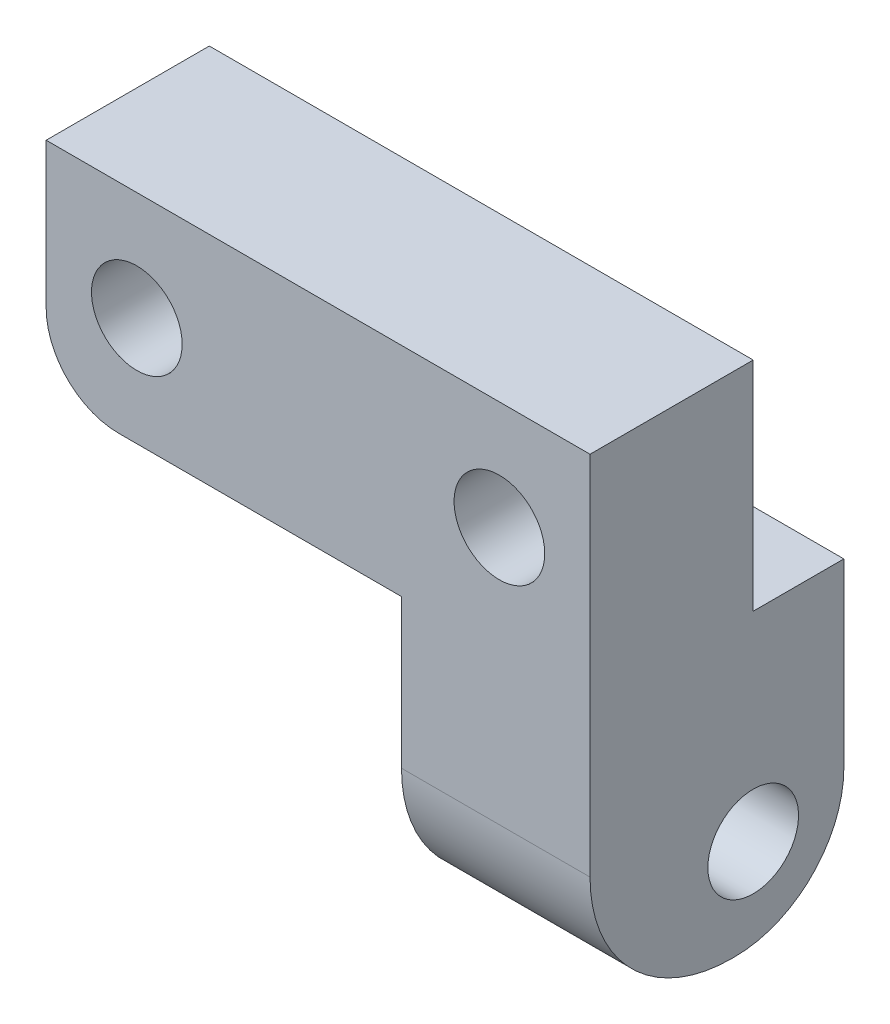
ISO-10303-21;
HEADER;
FILE_DESCRIPTION(('STEP AP214'),'2;1');
FILE_NAME('part.step','',(''),(''),'','','');
FILE_SCHEMA(('AUTOMOTIVE_DESIGN { 1 0 10303 214 1 1 1 1 }'));
ENDSEC;
DATA;
#1=APPLICATION_CONTEXT('core data for automotive mechanical design processes');
#2=APPLICATION_PROTOCOL_DEFINITION('international standard','automotive_design',2000,#1);
#3=PRODUCT_CONTEXT('',#1,'mechanical');
#4=PRODUCT('Part','Part','',(#3));
#5=PRODUCT_RELATED_PRODUCT_CATEGORY('part','',(#4));
#6=PRODUCT_DEFINITION_FORMATION('','',#4);
#7=PRODUCT_DEFINITION_CONTEXT('part definition',#1,'design');
#8=PRODUCT_DEFINITION('design','',#6,#7);
#9=PRODUCT_DEFINITION_SHAPE('','',#8);
#10=(LENGTH_UNIT() NAMED_UNIT(*) SI_UNIT(.MILLI.,.METRE.));
#11=(NAMED_UNIT(*) PLANE_ANGLE_UNIT() SI_UNIT($,.RADIAN.));
#12=(NAMED_UNIT(*) SI_UNIT($,.STERADIAN.) SOLID_ANGLE_UNIT());
#13=UNCERTAINTY_MEASURE_WITH_UNIT(LENGTH_MEASURE(1.E-05),#10,'distance_accuracy_value','');
#14=(GEOMETRIC_REPRESENTATION_CONTEXT(3) GLOBAL_UNCERTAINTY_ASSIGNED_CONTEXT((#13)) GLOBAL_UNIT_ASSIGNED_CONTEXT((#10,
#11,#12)) REPRESENTATION_CONTEXT('',''));
#15=CARTESIAN_POINT('',(0.,0.,0.));
#16=DIRECTION('',(0.,0.,1.));
#17=DIRECTION('',(1.,0.,0.));
#18=AXIS2_PLACEMENT_3D('',#15,#16,#17);
#19=CARTESIAN_POINT('',(0.,0.,0.));
#20=DIRECTION('',(0.,0.,-1.));
#21=DIRECTION('',(-1.,0.,0.));
#22=AXIS2_PLACEMENT_3D('',#19,#20,#21);
#23=PLANE('',#22);
#24=CARTESIAN_POINT('',(-5.,0.,0.));
#25=DIRECTION('',(0.,0.,1.));
#26=DIRECTION('',(1.,0.,0.));
#27=AXIS2_PLACEMENT_3D('',#24,#25,#26);
#28=CIRCLE('',#27,1.25);
#29=CARTESIAN_POINT('',(-3.75,0.,0.));
#30=VERTEX_POINT('',#29);
#31=EDGE_CURVE('E219',#30,#30,#28,.T.);
#32=ORIENTED_EDGE('',*,*,#31,.T.);
#33=EDGE_LOOP('',(#32));
#34=FACE_BOUND('',#33,.T.);
#35=DIRECTION('',(1.,0.,0.));
#36=VECTOR('',#35,1.);
#37=CARTESIAN_POINT('',(-7.5,-3.,0.));
#38=LINE('',#37,#36);
#39=CARTESIAN_POINT('',(-5.5,-3.,0.));
#40=VERTEX_POINT('',#39);
#41=CARTESIAN_POINT('',(2.3,-3.,0.));
#42=VERTEX_POINT('',#41);
#43=EDGE_CURVE('E193',#40,#42,#38,.T.);
#44=ORIENTED_EDGE('',*,*,#43,.F.);
#45=CARTESIAN_POINT('',(-5.5,-1.,0.));
#46=DIRECTION('',(0.,0.,-1.));
#47=DIRECTION('',(-1.,0.,0.));
#48=AXIS2_PLACEMENT_3D('',#45,#46,#47);
#49=CIRCLE('',#48,2.);
#50=CARTESIAN_POINT('',(-7.5,-1.,0.));
#51=VERTEX_POINT('',#50);
#52=EDGE_CURVE('E62',#40,#51,#49,.T.);
#53=ORIENTED_EDGE('',*,*,#52,.T.);
#54=DIRECTION('',(0.,-1.,0.));
#55=VECTOR('',#54,1.);
#56=CARTESIAN_POINT('',(-7.5,-3.,0.));
#57=LINE('',#56,#55);
#58=CARTESIAN_POINT('',(-7.5,3.,0.));
#59=VERTEX_POINT('',#58);
#60=EDGE_CURVE('E202',#59,#51,#57,.T.);
#61=ORIENTED_EDGE('',*,*,#60,.F.);
#62=DIRECTION('',(-1.,0.,0.));
#63=VECTOR('',#62,1.);
#64=CARTESIAN_POINT('',(-7.5,3.,0.));
#65=LINE('',#64,#63);
#66=CARTESIAN_POINT('',(7.5,3.,0.));
#67=VERTEX_POINT('',#66);
#68=EDGE_CURVE('E205',#67,#59,#65,.T.);
#69=ORIENTED_EDGE('',*,*,#68,.F.);
#70=DIRECTION('',(0.,1.,0.));
#71=VECTOR('',#70,1.);
#72=CARTESIAN_POINT('',(7.5,-3.,0.));
#73=LINE('',#72,#71);
#74=CARTESIAN_POINT('',(7.5,-3.,0.));
#75=VERTEX_POINT('',#74);
#76=EDGE_CURVE('E207',#75,#67,#73,.T.);
#77=ORIENTED_EDGE('',*,*,#76,.F.);
#78=EDGE_CURVE('E198',#42,#75,#38,.T.);
#79=ORIENTED_EDGE('',*,*,#78,.F.);
#80=EDGE_LOOP('',(#44,#53,#61,#69,#77,#79));
#81=FACE_BOUND('',#80,.T.);
#82=CARTESIAN_POINT('',(5.,0.,0.));
#83=DIRECTION('',(0.,0.,1.));
#84=DIRECTION('',(1.,0.,0.));
#85=AXIS2_PLACEMENT_3D('',#82,#83,#84);
#86=CIRCLE('',#85,1.25);
#87=CARTESIAN_POINT('',(6.25,0.,0.));
#88=VERTEX_POINT('',#87);
#89=EDGE_CURVE('E209',#88,#88,#86,.T.);
#90=ORIENTED_EDGE('',*,*,#89,.T.);
#91=EDGE_LOOP('',(#90));
#92=FACE_BOUND('',#91,.T.);
#93=ADVANCED_FACE('F40',(#34,#81,#92),#23,.T.);
#94=CARTESIAN_POINT('',(7.5,-3.,4.5));
#95=DIRECTION('',(-1.,0.,0.));
#96=DIRECTION('',(0.,0.,1.));
#97=AXIS2_PLACEMENT_3D('',#94,#95,#96);
#98=PLANE('',#97);
#99=CARTESIAN_POINT('',(7.5,-8.5,0.));
#100=DIRECTION('',(-1.,0.,0.));
#101=DIRECTION('',(0.,0.,1.));
#102=AXIS2_PLACEMENT_3D('',#99,#100,#101);
#103=CIRCLE('',#102,1.25);
#104=CARTESIAN_POINT('',(7.5,-8.5,1.25));
#105=VERTEX_POINT('',#104);
#106=EDGE_CURVE('E148',#105,#105,#103,.T.);
#107=ORIENTED_EDGE('',*,*,#106,.T.);
#108=EDGE_LOOP('',(#107));
#109=FACE_BOUND('',#108,.T.);
#110=DIRECTION('',(0.,0.,1.));
#111=VECTOR('',#110,1.);
#112=CARTESIAN_POINT('',(7.5,-11.,4.5));
#113=LINE('',#112,#111);
#114=CARTESIAN_POINT('',(7.5,-11.,0.499999999999999));
#115=VERTEX_POINT('',#114);
#116=CARTESIAN_POINT('',(7.5,-11.,0.6));
#117=VERTEX_POINT('',#116);
#118=EDGE_CURVE('E225',#115,#117,#113,.T.);
#119=ORIENTED_EDGE('',*,*,#118,.F.);
#120=CARTESIAN_POINT('',(7.5,-8.,0.499999999999999));
#121=DIRECTION('',(-1.,0.,0.));
#122=DIRECTION('',(0.,0.,1.));
#123=AXIS2_PLACEMENT_3D('',#120,#121,#122);
#124=CIRCLE('',#123,3.);
#125=CARTESIAN_POINT('',(7.5,-8.,-2.5));
#126=VERTEX_POINT('',#125);
#127=EDGE_CURVE('E186',#115,#126,#124,.F.);
#128=ORIENTED_EDGE('',*,*,#127,.T.);
#129=DIRECTION('',(0.,-1.,0.));
#130=VECTOR('',#129,1.);
#131=CARTESIAN_POINT('',(7.5,-11.,-2.5));
#132=LINE('',#131,#130);
#133=CARTESIAN_POINT('',(7.5,-3.,-2.5));
#134=VERTEX_POINT('',#133);
#135=EDGE_CURVE('E140',#134,#126,#132,.T.);
#136=ORIENTED_EDGE('',*,*,#135,.F.);
#137=DIRECTION('',(0.,0.,-1.));
#138=VECTOR('',#137,1.);
#139=CARTESIAN_POINT('',(7.5,-3.,4.5));
#140=LINE('',#139,#138);
#141=EDGE_CURVE('E138',#75,#134,#140,.T.);
#142=ORIENTED_EDGE('',*,*,#141,.F.);
#143=ORIENTED_EDGE('',*,*,#76,.T.);
#144=DIRECTION('',(0.,0.,-1.));
#145=VECTOR('',#144,1.);
#146=CARTESIAN_POINT('',(7.5,3.,4.5));
#147=LINE('',#146,#145);
#148=CARTESIAN_POINT('',(7.5,3.,4.5));
#149=VERTEX_POINT('',#148);
#150=EDGE_CURVE('E157',#149,#67,#147,.T.);
#151=ORIENTED_EDGE('',*,*,#150,.F.);
#152=DIRECTION('',(0.,1.,0.));
#153=VECTOR('',#152,1.);
#154=CARTESIAN_POINT('',(7.5,-3.,4.5));
#155=LINE('',#154,#153);
#156=CARTESIAN_POINT('',(7.5,-7.1,4.5));
#157=VERTEX_POINT('',#156);
#158=EDGE_CURVE('E199',#157,#149,#155,.T.);
#159=ORIENTED_EDGE('',*,*,#158,.F.);
#160=CARTESIAN_POINT('',(7.5,-7.1,0.6));
#161=DIRECTION('',(-1.,0.,0.));
#162=DIRECTION('',(0.,0.,1.));
#163=AXIS2_PLACEMENT_3D('',#160,#161,#162);
#164=CIRCLE('',#163,3.9);
#165=EDGE_CURVE('E178',#157,#117,#164,.F.);
#166=ORIENTED_EDGE('',*,*,#165,.T.);
#167=EDGE_LOOP('',(#119,#128,#136,#142,#143,#151,#159,#166));
#168=FACE_BOUND('',#167,.T.);
#169=ADVANCED_FACE('F238',(#109,#168),#98,.F.);
#170=CARTESIAN_POINT('',(-7.5,3.,4.5));
#171=DIRECTION('',(0.,-1.,0.));
#172=DIRECTION('',(0.,0.,-1.));
#173=AXIS2_PLACEMENT_3D('',#170,#171,#172);
#174=PLANE('',#173);
#175=ORIENTED_EDGE('',*,*,#68,.T.);
#176=DIRECTION('',(0.,0.,-1.));
#177=VECTOR('',#176,1.);
#178=CARTESIAN_POINT('',(-7.5,3.,4.5));
#179=LINE('',#178,#177);
#180=CARTESIAN_POINT('',(-7.5,3.,4.5));
#181=VERTEX_POINT('',#180);
#182=EDGE_CURVE('E164',#181,#59,#179,.T.);
#183=ORIENTED_EDGE('',*,*,#182,.F.);
#184=DIRECTION('',(-1.,0.,0.));
#185=VECTOR('',#184,1.);
#186=CARTESIAN_POINT('',(-7.5,3.,4.5));
#187=LINE('',#186,#185);
#188=EDGE_CURVE('E200',#149,#181,#187,.T.);
#189=ORIENTED_EDGE('',*,*,#188,.F.);
#190=ORIENTED_EDGE('',*,*,#150,.T.);
#191=EDGE_LOOP('',(#175,#183,#189,#190));
#192=FACE_BOUND('',#191,.T.);
#193=ADVANCED_FACE('F264',(#192),#174,.F.);
#194=CARTESIAN_POINT('',(-7.5,-3.,4.5));
#195=DIRECTION('',(1.,0.,0.));
#196=DIRECTION('',(0.,0.,-1.));
#197=AXIS2_PLACEMENT_3D('',#194,#195,#196);
#198=PLANE('',#197);
#199=ORIENTED_EDGE('',*,*,#60,.T.);
#200=DIRECTION('',(0.,0.,-1.));
#201=VECTOR('',#200,1.);
#202=CARTESIAN_POINT('',(-7.5,-1.,4.5));
#203=LINE('',#202,#201);
#204=CARTESIAN_POINT('',(-7.5,-1.,4.5));
#205=VERTEX_POINT('',#204);
#206=EDGE_CURVE('E48',#51,#205,#203,.F.);
#207=ORIENTED_EDGE('',*,*,#206,.T.);
#208=DIRECTION('',(0.,-1.,0.));
#209=VECTOR('',#208,1.);
#210=CARTESIAN_POINT('',(-7.5,-3.,4.5));
#211=LINE('',#210,#209);
#212=EDGE_CURVE('E211',#181,#205,#211,.T.);
#213=ORIENTED_EDGE('',*,*,#212,.F.);
#214=ORIENTED_EDGE('',*,*,#182,.T.);
#215=EDGE_LOOP('',(#199,#207,#213,#214));
#216=FACE_BOUND('',#215,.T.);
#217=ADVANCED_FACE('F273',(#216),#198,.F.);
#218=CARTESIAN_POINT('',(-7.5,-3.,4.5));
#219=DIRECTION('',(0.,1.,0.));
#220=DIRECTION('',(0.,0.,1.));
#221=AXIS2_PLACEMENT_3D('',#218,#219,#220);
#222=PLANE('',#221);
#223=DIRECTION('',(1.,0.,0.));
#224=VECTOR('',#223,1.);
#225=CARTESIAN_POINT('',(-7.5,-3.,4.5));
#226=LINE('',#225,#224);
#227=CARTESIAN_POINT('',(-5.5,-3.,4.5));
#228=VERTEX_POINT('',#227);
#229=CARTESIAN_POINT('',(2.3,-3.,4.5));
#230=VERTEX_POINT('',#229);
#231=EDGE_CURVE('E171',#228,#230,#226,.T.);
#232=ORIENTED_EDGE('',*,*,#231,.F.);
#233=DIRECTION('',(0.,0.,-1.));
#234=VECTOR('',#233,1.);
#235=CARTESIAN_POINT('',(-5.5,-3.,4.5));
#236=LINE('',#235,#234);
#237=EDGE_CURVE('E188',#228,#40,#236,.T.);
#238=ORIENTED_EDGE('',*,*,#237,.T.);
#239=ORIENTED_EDGE('',*,*,#43,.T.);
#240=DIRECTION('',(0.,0.,1.));
#241=VECTOR('',#240,1.);
#242=CARTESIAN_POINT('',(2.3,-3.,4.5));
#243=LINE('',#242,#241);
#244=EDGE_CURVE('E146',#42,#230,#243,.T.);
#245=ORIENTED_EDGE('',*,*,#244,.T.);
#246=EDGE_LOOP('',(#232,#238,#239,#245));
#247=FACE_BOUND('',#246,.T.);
#248=ADVANCED_FACE('F192',(#247),#222,.F.);
#249=CARTESIAN_POINT('',(0.,0.,4.5));
#250=DIRECTION('',(0.,0.,-1.));
#251=DIRECTION('',(-1.,0.,0.));
#252=AXIS2_PLACEMENT_3D('',#249,#250,#251);
#253=PLANE('',#252);
#254=CARTESIAN_POINT('',(-5.,0.,4.5));
#255=DIRECTION('',(0.,0.,1.));
#256=DIRECTION('',(1.,0.,0.));
#257=AXIS2_PLACEMENT_3D('',#254,#255,#256);
#258=CIRCLE('',#257,1.25);
#259=CARTESIAN_POINT('',(-3.75,0.,4.5));
#260=VERTEX_POINT('',#259);
#261=EDGE_CURVE('E222',#260,#260,#258,.T.);
#262=ORIENTED_EDGE('',*,*,#261,.F.);
#263=EDGE_LOOP('',(#262));
#264=FACE_BOUND('',#263,.T.);
#265=CARTESIAN_POINT('',(5.,0.,4.5));
#266=DIRECTION('',(0.,0.,1.));
#267=DIRECTION('',(1.,0.,0.));
#268=AXIS2_PLACEMENT_3D('',#265,#266,#267);
#269=CIRCLE('',#268,1.25);
#270=CARTESIAN_POINT('',(6.25,0.,4.5));
#271=VERTEX_POINT('',#270);
#272=EDGE_CURVE('E216',#271,#271,#269,.T.);
#273=ORIENTED_EDGE('',*,*,#272,.F.);
#274=EDGE_LOOP('',(#273));
#275=FACE_BOUND('',#274,.T.);
#276=ORIENTED_EDGE('',*,*,#212,.T.);
#277=CARTESIAN_POINT('',(-5.5,-1.,4.5));
#278=DIRECTION('',(0.,0.,-1.));
#279=DIRECTION('',(-1.,0.,0.));
#280=AXIS2_PLACEMENT_3D('',#277,#278,#279);
#281=CIRCLE('',#280,2.);
#282=EDGE_CURVE('E11',#205,#228,#281,.F.);
#283=ORIENTED_EDGE('',*,*,#282,.T.);
#284=ORIENTED_EDGE('',*,*,#231,.T.);
#285=DIRECTION('',(0.,-1.,0.));
#286=VECTOR('',#285,1.);
#287=CARTESIAN_POINT('',(2.3,-3.,4.5));
#288=LINE('',#287,#286);
#289=CARTESIAN_POINT('',(2.3,-7.1,4.5));
#290=VERTEX_POINT('',#289);
#291=EDGE_CURVE('E147',#230,#290,#288,.T.);
#292=ORIENTED_EDGE('',*,*,#291,.T.);
#293=DIRECTION('',(-1.,0.,0.));
#294=VECTOR('',#293,1.);
#295=CARTESIAN_POINT('',(0.,-7.1,4.5));
#296=LINE('',#295,#294);
#297=EDGE_CURVE('E176',#290,#157,#296,.F.);
#298=ORIENTED_EDGE('',*,*,#297,.T.);
#299=ORIENTED_EDGE('',*,*,#158,.T.);
#300=ORIENTED_EDGE('',*,*,#188,.T.);
#301=EDGE_LOOP('',(#276,#283,#284,#292,#298,#299,#300));
#302=FACE_BOUND('',#301,.T.);
#303=ADVANCED_FACE('F269',(#264,#275,#302),#253,.F.);
#304=CARTESIAN_POINT('',(5.,0.,4.5));
#305=DIRECTION('',(0.,0.,1.));
#306=DIRECTION('',(1.,0.,0.));
#307=AXIS2_PLACEMENT_3D('',#304,#305,#306);
#308=CYLINDRICAL_SURFACE('',#307,1.25);
#309=ORIENTED_EDGE('',*,*,#89,.F.);
#310=EDGE_LOOP('',(#309));
#311=FACE_BOUND('',#310,.T.);
#312=ORIENTED_EDGE('',*,*,#272,.T.);
#313=EDGE_LOOP('',(#312));
#314=FACE_BOUND('',#313,.T.);
#315=ADVANCED_FACE('F296',(#311,#314),#308,.F.);
#316=CARTESIAN_POINT('',(-5.,0.,4.5));
#317=DIRECTION('',(0.,0.,1.));
#318=DIRECTION('',(1.,0.,0.));
#319=AXIS2_PLACEMENT_3D('',#316,#317,#318);
#320=CYLINDRICAL_SURFACE('',#319,1.25);
#321=ORIENTED_EDGE('',*,*,#31,.F.);
#322=EDGE_LOOP('',(#321));
#323=FACE_BOUND('',#322,.T.);
#324=ORIENTED_EDGE('',*,*,#261,.T.);
#325=EDGE_LOOP('',(#324));
#326=FACE_BOUND('',#325,.T.);
#327=ADVANCED_FACE('F255',(#323,#326),#320,.F.);
#328=CARTESIAN_POINT('',(18.1301458127346,-3.,4.5));
#329=DIRECTION('',(0.,-1.,0.));
#330=DIRECTION('',(0.,0.,-1.));
#331=AXIS2_PLACEMENT_3D('',#328,#329,#330);
#332=PLANE('',#331);
#333=CARTESIAN_POINT('',(2.3,-3.,-2.5));
#334=VERTEX_POINT('',#333);
#335=EDGE_CURVE('E135',#334,#42,#243,.T.);
#336=ORIENTED_EDGE('',*,*,#335,.T.);
#337=ORIENTED_EDGE('',*,*,#78,.T.);
#338=ORIENTED_EDGE('',*,*,#141,.T.);
#339=DIRECTION('',(-1.,0.,0.));
#340=VECTOR('',#339,1.);
#341=CARTESIAN_POINT('',(18.1301458127346,-3.,-2.5));
#342=LINE('',#341,#340);
#343=EDGE_CURVE('E125',#134,#334,#342,.T.);
#344=ORIENTED_EDGE('',*,*,#343,.T.);
#345=EDGE_LOOP('',(#336,#337,#338,#344));
#346=FACE_BOUND('',#345,.T.);
#347=ADVANCED_FACE('F134',(#346),#332,.F.);
#348=CARTESIAN_POINT('',(2.3,0.,0.));
#349=DIRECTION('',(1.,0.,0.));
#350=DIRECTION('',(0.,0.,-1.));
#351=AXIS2_PLACEMENT_3D('',#348,#349,#350);
#352=PLANE('',#351);
#353=CARTESIAN_POINT('',(2.3,-8.5,0.));
#354=DIRECTION('',(-1.,0.,0.));
#355=DIRECTION('',(0.,0.,1.));
#356=AXIS2_PLACEMENT_3D('',#353,#354,#355);
#357=CIRCLE('',#356,1.24999999999999);
#358=CARTESIAN_POINT('',(2.3,-8.5,1.24999999999999));
#359=VERTEX_POINT('',#358);
#360=EDGE_CURVE('E153',#359,#359,#357,.T.);
#361=ORIENTED_EDGE('',*,*,#360,.F.);
#362=EDGE_LOOP('',(#361));
#363=FACE_BOUND('',#362,.T.);
#364=DIRECTION('',(0.,1.,0.));
#365=VECTOR('',#364,1.);
#366=CARTESIAN_POINT('',(2.3,-11.,-2.5));
#367=LINE('',#366,#365);
#368=CARTESIAN_POINT('',(2.3,-8.,-2.5));
#369=VERTEX_POINT('',#368);
#370=EDGE_CURVE('E121',#369,#334,#367,.T.);
#371=ORIENTED_EDGE('',*,*,#370,.F.);
#372=CARTESIAN_POINT('',(2.3,-8.,0.499999999999999));
#373=DIRECTION('',(1.,0.,0.));
#374=DIRECTION('',(0.,0.,-1.));
#375=AXIS2_PLACEMENT_3D('',#372,#373,#374);
#376=CIRCLE('',#375,3.);
#377=CARTESIAN_POINT('',(2.3,-11.,0.499999999999999));
#378=VERTEX_POINT('',#377);
#379=EDGE_CURVE('E182',#369,#378,#376,.F.);
#380=ORIENTED_EDGE('',*,*,#379,.T.);
#381=DIRECTION('',(0.,0.,-1.));
#382=VECTOR('',#381,1.);
#383=CARTESIAN_POINT('',(2.3,-11.,4.5));
#384=LINE('',#383,#382);
#385=CARTESIAN_POINT('',(2.3,-11.,0.6));
#386=VERTEX_POINT('',#385);
#387=EDGE_CURVE('E130',#386,#378,#384,.T.);
#388=ORIENTED_EDGE('',*,*,#387,.F.);
#389=CARTESIAN_POINT('',(2.3,-7.1,0.6));
#390=DIRECTION('',(1.,0.,0.));
#391=DIRECTION('',(0.,0.,-1.));
#392=AXIS2_PLACEMENT_3D('',#389,#390,#391);
#393=CIRCLE('',#392,3.9);
#394=EDGE_CURVE('E161',#386,#290,#393,.F.);
#395=ORIENTED_EDGE('',*,*,#394,.T.);
#396=ORIENTED_EDGE('',*,*,#291,.F.);
#397=ORIENTED_EDGE('',*,*,#244,.F.);
#398=ORIENTED_EDGE('',*,*,#335,.F.);
#399=EDGE_LOOP('',(#371,#380,#388,#395,#396,#397,#398));
#400=FACE_BOUND('',#399,.T.);
#401=ADVANCED_FACE('F143',(#363,#400),#352,.F.);
#402=CARTESIAN_POINT('',(18.1301458127346,-11.,-2.5));
#403=DIRECTION('',(0.,0.,1.));
#404=DIRECTION('',(1.,0.,0.));
#405=AXIS2_PLACEMENT_3D('',#402,#403,#404);
#406=PLANE('',#405);
#407=ORIENTED_EDGE('',*,*,#135,.T.);
#408=DIRECTION('',(-1.,0.,0.));
#409=VECTOR('',#408,1.);
#410=CARTESIAN_POINT('',(18.1301458127346,-8.,-2.5));
#411=LINE('',#410,#409);
#412=EDGE_CURVE('E127',#126,#369,#411,.T.);
#413=ORIENTED_EDGE('',*,*,#412,.T.);
#414=ORIENTED_EDGE('',*,*,#370,.T.);
#415=ORIENTED_EDGE('',*,*,#343,.F.);
#416=EDGE_LOOP('',(#407,#413,#414,#415));
#417=FACE_BOUND('',#416,.T.);
#418=ADVANCED_FACE('F124',(#417),#406,.F.);
#419=CARTESIAN_POINT('',(18.1301458127346,-11.,4.5));
#420=DIRECTION('',(0.,1.,0.));
#421=DIRECTION('',(0.,0.,1.));
#422=AXIS2_PLACEMENT_3D('',#419,#420,#421);
#423=PLANE('',#422);
#424=ORIENTED_EDGE('',*,*,#387,.T.);
#425=DIRECTION('',(-1.,0.,0.));
#426=VECTOR('',#425,1.);
#427=CARTESIAN_POINT('',(18.1301458127346,-11.,0.499999999999999));
#428=LINE('',#427,#426);
#429=EDGE_CURVE('E184',#378,#115,#428,.F.);
#430=ORIENTED_EDGE('',*,*,#429,.T.);
#431=ORIENTED_EDGE('',*,*,#118,.T.);
#432=DIRECTION('',(-1.,0.,0.));
#433=VECTOR('',#432,1.);
#434=CARTESIAN_POINT('',(18.1301458127346,-11.,0.6));
#435=LINE('',#434,#433);
#436=EDGE_CURVE('E156',#117,#386,#435,.T.);
#437=ORIENTED_EDGE('',*,*,#436,.T.);
#438=EDGE_LOOP('',(#424,#430,#431,#437));
#439=FACE_BOUND('',#438,.T.);
#440=ADVANCED_FACE('F231',(#439),#423,.F.);
#441=CARTESIAN_POINT('',(18.1301458127346,-7.1,0.6));
#442=DIRECTION('',(-1.,0.,0.));
#443=DIRECTION('',(0.,0.,1.));
#444=AXIS2_PLACEMENT_3D('',#441,#442,#443);
#445=CYLINDRICAL_SURFACE('',#444,3.9);
#446=ORIENTED_EDGE('',*,*,#165,.F.);
#447=ORIENTED_EDGE('',*,*,#297,.F.);
#448=ORIENTED_EDGE('',*,*,#394,.F.);
#449=ORIENTED_EDGE('',*,*,#436,.F.);
#450=EDGE_LOOP('',(#446,#447,#448,#449));
#451=FACE_BOUND('',#450,.T.);
#452=ADVANCED_FACE('F278',(#451),#445,.T.);
#453=CARTESIAN_POINT('',(18.1301458127346,-8.,0.499999999999999));
#454=DIRECTION('',(-1.,0.,0.));
#455=DIRECTION('',(0.,0.,1.));
#456=AXIS2_PLACEMENT_3D('',#453,#454,#455);
#457=CYLINDRICAL_SURFACE('',#456,3.);
#458=ORIENTED_EDGE('',*,*,#127,.F.);
#459=ORIENTED_EDGE('',*,*,#429,.F.);
#460=ORIENTED_EDGE('',*,*,#379,.F.);
#461=ORIENTED_EDGE('',*,*,#412,.F.);
#462=EDGE_LOOP('',(#458,#459,#460,#461));
#463=FACE_BOUND('',#462,.T.);
#464=ADVANCED_FACE('F236',(#463),#457,.T.);
#465=CARTESIAN_POINT('',(2.3,-8.5,0.));
#466=DIRECTION('',(-1.,0.,0.));
#467=DIRECTION('',(0.,0.,1.));
#468=AXIS2_PLACEMENT_3D('',#465,#466,#467);
#469=CYLINDRICAL_SURFACE('',#468,1.24999999999999);
#470=ORIENTED_EDGE('',*,*,#106,.F.);
#471=EDGE_LOOP('',(#470));
#472=FACE_BOUND('',#471,.T.);
#473=ORIENTED_EDGE('',*,*,#360,.T.);
#474=EDGE_LOOP('',(#473));
#475=FACE_BOUND('',#474,.T.);
#476=ADVANCED_FACE('F246',(#472,#475),#469,.F.);
#477=CARTESIAN_POINT('',(-5.5,-1.,4.5));
#478=DIRECTION('',(0.,0.,-1.));
#479=DIRECTION('',(-1.,0.,0.));
#480=AXIS2_PLACEMENT_3D('',#477,#478,#479);
#481=CYLINDRICAL_SURFACE('',#480,2.);
#482=ORIENTED_EDGE('',*,*,#282,.F.);
#483=ORIENTED_EDGE('',*,*,#206,.F.);
#484=ORIENTED_EDGE('',*,*,#52,.F.);
#485=ORIENTED_EDGE('',*,*,#237,.F.);
#486=EDGE_LOOP('',(#482,#483,#484,#485));
#487=FACE_BOUND('',#486,.T.);
#488=ADVANCED_FACE('F42',(#487),#481,.T.);
#489=CLOSED_SHELL('',(#93,#169,#193,#217,#248,#303,#315,#327,#347,#401,#418,#440,#452,#464,#476,#488));
#490=MANIFOLD_SOLID_BREP('B2',#489);
#491=ADVANCED_BREP_SHAPE_REPRESENTATION('',(#18,#490),#14);
#492=SHAPE_DEFINITION_REPRESENTATION(#9,#491);
ENDSEC;
END-ISO-10303-21;
